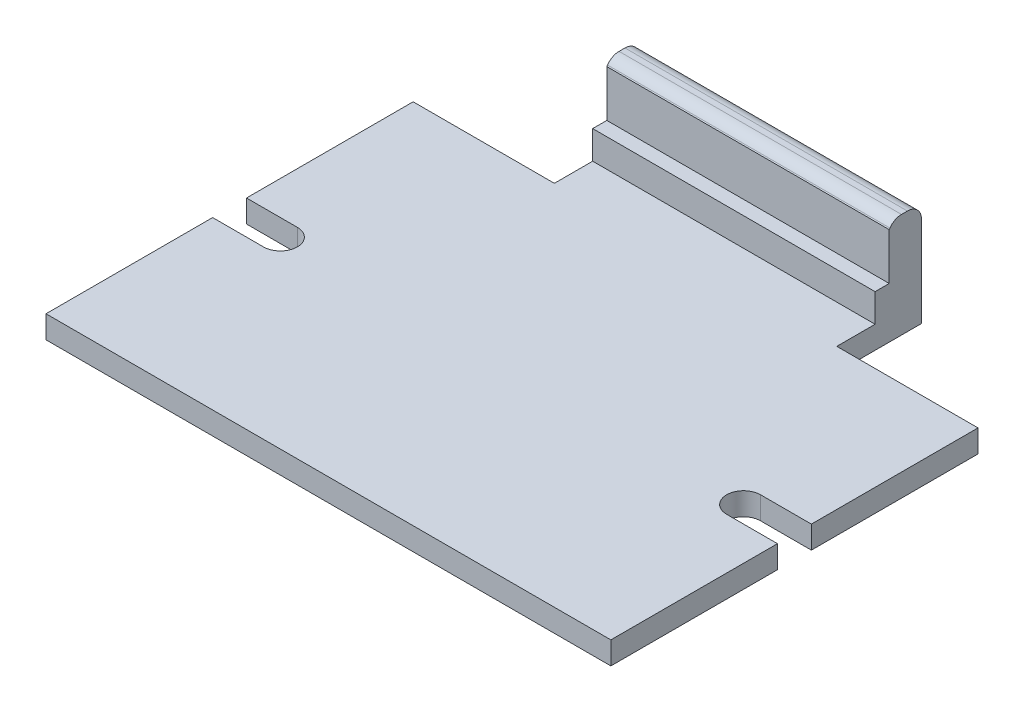
ISO-10303-21;
HEADER;
FILE_DESCRIPTION(('STEP AP214'),'2;1');
FILE_NAME('part.step','',(''),(''),'','','');
FILE_SCHEMA(('AUTOMOTIVE_DESIGN { 1 0 10303 214 1 1 1 1 }'));
ENDSEC;
DATA;
#1=APPLICATION_CONTEXT('core data for automotive mechanical design processes');
#2=APPLICATION_PROTOCOL_DEFINITION('international standard','automotive_design',2000,#1);
#3=PRODUCT_CONTEXT('',#1,'mechanical');
#4=PRODUCT('Part','Part','',(#3));
#5=PRODUCT_RELATED_PRODUCT_CATEGORY('part','',(#4));
#6=PRODUCT_DEFINITION_FORMATION('','',#4);
#7=PRODUCT_DEFINITION_CONTEXT('part definition',#1,'design');
#8=PRODUCT_DEFINITION('design','',#6,#7);
#9=PRODUCT_DEFINITION_SHAPE('','',#8);
#10=(LENGTH_UNIT() NAMED_UNIT(*) SI_UNIT(.MILLI.,.METRE.));
#11=(NAMED_UNIT(*) PLANE_ANGLE_UNIT() SI_UNIT($,.RADIAN.));
#12=(NAMED_UNIT(*) SI_UNIT($,.STERADIAN.) SOLID_ANGLE_UNIT());
#13=UNCERTAINTY_MEASURE_WITH_UNIT(LENGTH_MEASURE(1.E-05),#10,'distance_accuracy_value','');
#14=(GEOMETRIC_REPRESENTATION_CONTEXT(3) GLOBAL_UNCERTAINTY_ASSIGNED_CONTEXT((#13)) GLOBAL_UNIT_ASSIGNED_CONTEXT((#10,
#11,#12)) REPRESENTATION_CONTEXT('',''));
#15=CARTESIAN_POINT('',(0.,0.,0.));
#16=DIRECTION('',(0.,0.,1.));
#17=DIRECTION('',(1.,0.,0.));
#18=AXIS2_PLACEMENT_3D('',#15,#16,#17);
#19=CARTESIAN_POINT('',(200.,32.,-74.0137427767077));
#20=DIRECTION('',(1.,0.,0.));
#21=DIRECTION('',(0.,0.,-1.));
#22=AXIS2_PLACEMENT_3D('',#19,#20,#21);
#23=PLANE('',#22);
#24=DIRECTION('',(0.,-1.,0.));
#25=VECTOR('',#24,1.);
#26=CARTESIAN_POINT('',(200.,9.99999999999999,21.9862572232923));
#27=LINE('',#26,#25);
#28=CARTESIAN_POINT('',(200.,8.00000000000002,21.9862572232923));
#29=VERTEX_POINT('',#28);
#30=CARTESIAN_POINT('',(200.,0.,21.9862572232923));
#31=VERTEX_POINT('',#30);
#32=EDGE_CURVE('E44',#29,#31,#27,.T.);
#33=ORIENTED_EDGE('',*,*,#32,.F.);
#34=DIRECTION('',(0.,0.,1.));
#35=VECTOR('',#34,1.);
#36=CARTESIAN_POINT('',(200.,8.00000000000002,-49.0137427767077));
#37=LINE('',#36,#35);
#38=CARTESIAN_POINT('',(200.,8.,80.9862572232923));
#39=VERTEX_POINT('',#38);
#40=EDGE_CURVE('E283',#29,#39,#37,.T.);
#41=ORIENTED_EDGE('',*,*,#40,.T.);
#42=DIRECTION('',(0.,-1.,0.));
#43=VECTOR('',#42,1.);
#44=CARTESIAN_POINT('',(200.,8.,80.9862572232923));
#45=LINE('',#44,#43);
#46=CARTESIAN_POINT('',(200.,0.,80.9862572232923));
#47=VERTEX_POINT('',#46);
#48=EDGE_CURVE('E281',#39,#47,#45,.T.);
#49=ORIENTED_EDGE('',*,*,#48,.T.);
#50=DIRECTION('',(0.,0.,-1.));
#51=VECTOR('',#50,1.);
#52=CARTESIAN_POINT('',(200.,0.,80.9862572232923));
#53=LINE('',#52,#51);
#54=EDGE_CURVE('E274',#47,#31,#53,.T.);
#55=ORIENTED_EDGE('',*,*,#54,.T.);
#56=EDGE_LOOP('',(#33,#41,#49,#55));
#57=FACE_BOUND('',#56,.T.);
#58=ADVANCED_FACE('F36',(#57),#23,.T.);
#59=CARTESIAN_POINT('',(0.,32.,-74.0137427767077));
#60=DIRECTION('',(1.,0.,0.));
#61=DIRECTION('',(0.,0.,-1.));
#62=AXIS2_PLACEMENT_3D('',#59,#60,#61);
#63=PLANE('',#62);
#64=DIRECTION('',(0.,0.,-1.));
#65=VECTOR('',#64,1.);
#66=CARTESIAN_POINT('',(0.,0.,80.9862572232923));
#67=LINE('',#66,#65);
#68=CARTESIAN_POINT('',(0.,0.,9.98625722329233));
#69=VERTEX_POINT('',#68);
#70=CARTESIAN_POINT('',(0.,0.,-49.0137427767077));
#71=VERTEX_POINT('',#70);
#72=EDGE_CURVE('E293',#69,#71,#67,.T.);
#73=ORIENTED_EDGE('',*,*,#72,.F.);
#74=DIRECTION('',(0.,-1.,0.));
#75=VECTOR('',#74,1.);
#76=CARTESIAN_POINT('',(0.,9.99999999999999,9.98625722329233));
#77=LINE('',#76,#75);
#78=CARTESIAN_POINT('',(0.,8.00000000000002,9.98625722329233));
#79=VERTEX_POINT('',#78);
#80=EDGE_CURVE('E253',#69,#79,#77,.F.);
#81=ORIENTED_EDGE('',*,*,#80,.T.);
#82=DIRECTION('',(0.,0.,1.));
#83=VECTOR('',#82,1.);
#84=CARTESIAN_POINT('',(0.,8.00000000000002,-49.0137427767077));
#85=LINE('',#84,#83);
#86=CARTESIAN_POINT('',(0.,8.00000000000001,-49.0137427767077));
#87=VERTEX_POINT('',#86);
#88=EDGE_CURVE('E298',#87,#79,#85,.T.);
#89=ORIENTED_EDGE('',*,*,#88,.F.);
#90=DIRECTION('',(0.,-1.,0.));
#91=VECTOR('',#90,1.);
#92=CARTESIAN_POINT('',(0.,32.,-49.0137427767077));
#93=LINE('',#92,#91);
#94=EDGE_CURVE('E240',#87,#71,#93,.T.);
#95=ORIENTED_EDGE('',*,*,#94,.T.);
#96=EDGE_LOOP('',(#73,#81,#89,#95));
#97=FACE_BOUND('',#96,.T.);
#98=ADVANCED_FACE('F419',(#97),#63,.F.);
#99=CARTESIAN_POINT('',(200.,8.,80.9862572232923));
#100=DIRECTION('',(0.,0.,-1.));
#101=DIRECTION('',(-1.,0.,0.));
#102=AXIS2_PLACEMENT_3D('',#99,#100,#101);
#103=PLANE('',#102);
#104=DIRECTION('',(0.,-1.,0.));
#105=VECTOR('',#104,1.);
#106=CARTESIAN_POINT('',(0.,8.,80.9862572232923));
#107=LINE('',#106,#105);
#108=CARTESIAN_POINT('',(0.,8.,80.9862572232923));
#109=VERTEX_POINT('',#108);
#110=CARTESIAN_POINT('',(0.,0.,80.9862572232923));
#111=VERTEX_POINT('',#110);
#112=EDGE_CURVE('E290',#109,#111,#107,.T.);
#113=ORIENTED_EDGE('',*,*,#112,.T.);
#114=DIRECTION('',(-1.,0.,0.));
#115=VECTOR('',#114,1.);
#116=CARTESIAN_POINT('',(200.,0.,80.9862572232923));
#117=LINE('',#116,#115);
#118=EDGE_CURVE('E237',#47,#111,#117,.T.);
#119=ORIENTED_EDGE('',*,*,#118,.F.);
#120=ORIENTED_EDGE('',*,*,#48,.F.);
#121=DIRECTION('',(-1.,0.,0.));
#122=VECTOR('',#121,1.);
#123=CARTESIAN_POINT('',(200.,8.,80.9862572232923));
#124=LINE('',#123,#122);
#125=EDGE_CURVE('E222',#39,#109,#124,.T.);
#126=ORIENTED_EDGE('',*,*,#125,.T.);
#127=EDGE_LOOP('',(#113,#119,#120,#126));
#128=FACE_BOUND('',#127,.T.);
#129=ADVANCED_FACE('F38',(#128),#103,.F.);
#130=CARTESIAN_POINT('',(200.,0.,80.9862572232923));
#131=DIRECTION('',(0.,1.,0.));
#132=DIRECTION('',(0.,0.,1.));
#133=AXIS2_PLACEMENT_3D('',#130,#131,#132);
#134=PLANE('',#133);
#135=CARTESIAN_POINT('',(182.,0.,15.9862572232923));
#136=DIRECTION('',(0.,-1.,0.));
#137=DIRECTION('',(0.,0.,1.));
#138=AXIS2_PLACEMENT_3D('',#135,#136,#137);
#139=CIRCLE('',#138,6.);
#140=CARTESIAN_POINT('',(182.,0.,21.9862572232923));
#141=VERTEX_POINT('',#140);
#142=CARTESIAN_POINT('',(182.,0.,9.98625722329233));
#143=VERTEX_POINT('',#142);
#144=EDGE_CURVE('E277',#141,#143,#139,.T.);
#145=ORIENTED_EDGE('',*,*,#144,.F.);
#146=DIRECTION('',(-1.,0.,0.));
#147=VECTOR('',#146,1.);
#148=CARTESIAN_POINT('',(182.,0.,21.9862572232923));
#149=LINE('',#148,#147);
#150=EDGE_CURVE('E266',#31,#141,#149,.T.);
#151=ORIENTED_EDGE('',*,*,#150,.F.);
#152=ORIENTED_EDGE('',*,*,#54,.F.);
#153=ORIENTED_EDGE('',*,*,#118,.T.);
#154=CARTESIAN_POINT('',(0.,0.,21.9862572232923));
#155=VERTEX_POINT('',#154);
#156=EDGE_CURVE('E295',#111,#155,#67,.T.);
#157=ORIENTED_EDGE('',*,*,#156,.T.);
#158=DIRECTION('',(-1.,0.,0.));
#159=VECTOR('',#158,1.);
#160=CARTESIAN_POINT('',(18.,0.,21.9862572232923));
#161=LINE('',#160,#159);
#162=CARTESIAN_POINT('',(18.,0.,21.9862572232923));
#163=VERTEX_POINT('',#162);
#164=EDGE_CURVE('E312',#163,#155,#161,.T.);
#165=ORIENTED_EDGE('',*,*,#164,.F.);
#166=CARTESIAN_POINT('',(18.,0.,15.9862572232923));
#167=DIRECTION('',(0.,-1.,0.));
#168=DIRECTION('',(0.,0.,-1.));
#169=AXIS2_PLACEMENT_3D('',#166,#167,#168);
#170=CIRCLE('',#169,6.);
#171=CARTESIAN_POINT('',(18.,0.,9.98625722329233));
#172=VERTEX_POINT('',#171);
#173=EDGE_CURVE('E315',#172,#163,#170,.T.);
#174=ORIENTED_EDGE('',*,*,#173,.F.);
#175=DIRECTION('',(1.,0.,0.));
#176=VECTOR('',#175,1.);
#177=CARTESIAN_POINT('',(18.,0.,9.98625722329233));
#178=LINE('',#177,#176);
#179=EDGE_CURVE('E317',#69,#172,#178,.T.);
#180=ORIENTED_EDGE('',*,*,#179,.F.);
#181=ORIENTED_EDGE('',*,*,#72,.T.);
#182=DIRECTION('',(-1.,0.,0.));
#183=VECTOR('',#182,1.);
#184=CARTESIAN_POINT('',(50.,0.,-49.0137427767077));
#185=LINE('',#184,#183);
#186=CARTESIAN_POINT('',(50.,0.,-49.0137427767077));
#187=VERTEX_POINT('',#186);
#188=EDGE_CURVE('E347',#187,#71,#185,.T.);
#189=ORIENTED_EDGE('',*,*,#188,.F.);
#190=DIRECTION('',(0.,0.,1.));
#191=VECTOR('',#190,1.);
#192=CARTESIAN_POINT('',(50.,0.,-49.0137427767077));
#193=LINE('',#192,#191);
#194=CARTESIAN_POINT('',(50.,0.,-79.0137427767077));
#195=VERTEX_POINT('',#194);
#196=EDGE_CURVE('E344',#195,#187,#193,.T.);
#197=ORIENTED_EDGE('',*,*,#196,.F.);
#198=DIRECTION('',(-1.,0.,0.));
#199=VECTOR('',#198,1.);
#200=CARTESIAN_POINT('',(200.,0.,-79.0137427767077));
#201=LINE('',#200,#199);
#202=CARTESIAN_POINT('',(150.,0.,-79.0137427767077));
#203=VERTEX_POINT('',#202);
#204=EDGE_CURVE('E235',#203,#195,#201,.T.);
#205=ORIENTED_EDGE('',*,*,#204,.F.);
#206=DIRECTION('',(0.,0.,-1.));
#207=VECTOR('',#206,1.);
#208=CARTESIAN_POINT('',(150.,0.,-49.0137427767077));
#209=LINE('',#208,#207);
#210=CARTESIAN_POINT('',(150.,0.,-49.0137427767077));
#211=VERTEX_POINT('',#210);
#212=EDGE_CURVE('E213',#211,#203,#209,.T.);
#213=ORIENTED_EDGE('',*,*,#212,.F.);
#214=DIRECTION('',(-1.,0.,0.));
#215=VECTOR('',#214,1.);
#216=CARTESIAN_POINT('',(150.,0.,-49.0137427767077));
#217=LINE('',#216,#215);
#218=CARTESIAN_POINT('',(200.,0.,-49.0137427767077));
#219=VERTEX_POINT('',#218);
#220=EDGE_CURVE('E210',#219,#211,#217,.T.);
#221=ORIENTED_EDGE('',*,*,#220,.F.);
#222=CARTESIAN_POINT('',(200.,0.,9.98625722329233));
#223=VERTEX_POINT('',#222);
#224=EDGE_CURVE('E284',#223,#219,#53,.T.);
#225=ORIENTED_EDGE('',*,*,#224,.F.);
#226=DIRECTION('',(1.,0.,0.));
#227=VECTOR('',#226,1.);
#228=CARTESIAN_POINT('',(182.,0.,9.98625722329233));
#229=LINE('',#228,#227);
#230=EDGE_CURVE('E59',#143,#223,#229,.T.);
#231=ORIENTED_EDGE('',*,*,#230,.F.);
#232=EDGE_LOOP('',(#145,#151,#152,#153,#157,#165,#174,#180,#181,#189,#197,#205,#213,#221,#225,#231));
#233=FACE_BOUND('',#232,.T.);
#234=ADVANCED_FACE('F273',(#233),#134,.F.);
#235=CARTESIAN_POINT('',(200.,0.,-79.0137427767077));
#236=DIRECTION('',(0.,0.,1.));
#237=DIRECTION('',(1.,0.,0.));
#238=AXIS2_PLACEMENT_3D('',#235,#236,#237);
#239=PLANE('',#238);
#240=DIRECTION('',(-1.,0.,0.));
#241=VECTOR('',#240,1.);
#242=CARTESIAN_POINT('',(200.,32.,-79.0137427767077));
#243=LINE('',#242,#241);
#244=CARTESIAN_POINT('',(150.,32.,-79.0137427767077));
#245=VERTEX_POINT('',#244);
#246=CARTESIAN_POINT('',(50.,32.,-79.0137427767077));
#247=VERTEX_POINT('',#246);
#248=EDGE_CURVE('E233',#245,#247,#243,.T.);
#249=ORIENTED_EDGE('',*,*,#248,.F.);
#250=DIRECTION('',(0.,-1.,0.));
#251=VECTOR('',#250,1.);
#252=CARTESIAN_POINT('',(150.,52.,-79.0137427767077));
#253=LINE('',#252,#251);
#254=EDGE_CURVE('E212',#245,#203,#253,.T.);
#255=ORIENTED_EDGE('',*,*,#254,.T.);
#256=ORIENTED_EDGE('',*,*,#204,.T.);
#257=DIRECTION('',(0.,-1.,0.));
#258=VECTOR('',#257,1.);
#259=CARTESIAN_POINT('',(50.,52.,-79.0137427767077));
#260=LINE('',#259,#258);
#261=EDGE_CURVE('E351',#247,#195,#260,.T.);
#262=ORIENTED_EDGE('',*,*,#261,.F.);
#263=EDGE_LOOP('',(#249,#255,#256,#262));
#264=FACE_BOUND('',#263,.T.);
#265=ADVANCED_FACE('F376',(#264),#239,.F.);
#266=CARTESIAN_POINT('',(200.,32.,-74.0137427767077));
#267=DIRECTION('',(-1.,0.,0.));
#268=DIRECTION('',(0.,0.,1.));
#269=AXIS2_PLACEMENT_3D('',#266,#267,#268);
#270=CYLINDRICAL_SURFACE('',#269,5.);
#271=DIRECTION('',(-1.,0.,0.));
#272=VECTOR('',#271,1.);
#273=CARTESIAN_POINT('',(200.,37.,-74.0137427767077));
#274=LINE('',#273,#272);
#275=CARTESIAN_POINT('',(150.,37.,-74.0137427767077));
#276=VERTEX_POINT('',#275);
#277=CARTESIAN_POINT('',(50.,37.,-74.0137427767077));
#278=VERTEX_POINT('',#277);
#279=EDGE_CURVE('E231',#276,#278,#274,.T.);
#280=ORIENTED_EDGE('',*,*,#279,.F.);
#281=CARTESIAN_POINT('',(150.,32.,-74.0137427767077));
#282=DIRECTION('',(-1.,0.,0.));
#283=DIRECTION('',(0.,0.,1.));
#284=AXIS2_PLACEMENT_3D('',#281,#282,#283);
#285=CIRCLE('',#284,5.);
#286=EDGE_CURVE('E341',#276,#245,#285,.T.);
#287=ORIENTED_EDGE('',*,*,#286,.T.);
#288=ORIENTED_EDGE('',*,*,#248,.T.);
#289=CARTESIAN_POINT('',(50.,32.,-74.0137427767077));
#290=DIRECTION('',(1.,0.,0.));
#291=DIRECTION('',(0.,0.,-1.));
#292=AXIS2_PLACEMENT_3D('',#289,#290,#291);
#293=CIRCLE('',#292,5.);
#294=EDGE_CURVE('E294',#247,#278,#293,.T.);
#295=ORIENTED_EDGE('',*,*,#294,.T.);
#296=EDGE_LOOP('',(#280,#287,#288,#295));
#297=FACE_BOUND('',#296,.T.);
#298=ADVANCED_FACE('F366',(#297),#270,.T.);
#299=CARTESIAN_POINT('',(200.,37.,-74.0137427767077));
#300=DIRECTION('',(0.,-1.,0.));
#301=DIRECTION('',(0.,0.,-1.));
#302=AXIS2_PLACEMENT_3D('',#299,#300,#301);
#303=PLANE('',#302);
#304=DIRECTION('',(-1.,0.,0.));
#305=VECTOR('',#304,1.);
#306=CARTESIAN_POINT('',(200.,37.,-71.9225966375477));
#307=LINE('',#306,#305);
#308=CARTESIAN_POINT('',(150.,37.,-71.9225966375477));
#309=VERTEX_POINT('',#308);
#310=CARTESIAN_POINT('',(50.,37.,-71.9225966375477));
#311=VERTEX_POINT('',#310);
#312=EDGE_CURVE('E224',#309,#311,#307,.T.);
#313=ORIENTED_EDGE('',*,*,#312,.F.);
#314=DIRECTION('',(0.,0.,-1.));
#315=VECTOR('',#314,1.);
#316=CARTESIAN_POINT('',(150.,37.,-74.0137427767077));
#317=LINE('',#316,#315);
#318=EDGE_CURVE('E338',#309,#276,#317,.T.);
#319=ORIENTED_EDGE('',*,*,#318,.T.);
#320=ORIENTED_EDGE('',*,*,#279,.T.);
#321=DIRECTION('',(0.,0.,1.));
#322=VECTOR('',#321,1.);
#323=CARTESIAN_POINT('',(50.,37.,-74.0137427767077));
#324=LINE('',#323,#322);
#325=EDGE_CURVE('E360',#278,#311,#324,.T.);
#326=ORIENTED_EDGE('',*,*,#325,.T.);
#327=EDGE_LOOP('',(#313,#319,#320,#326));
#328=FACE_BOUND('',#327,.T.);
#329=ADVANCED_FACE('F439',(#328),#303,.F.);
#330=CARTESIAN_POINT('',(200.,32.,-71.9225966375477));
#331=DIRECTION('',(-1.,0.,0.));
#332=DIRECTION('',(0.,0.,1.));
#333=AXIS2_PLACEMENT_3D('',#330,#331,#332);
#334=CYLINDRICAL_SURFACE('',#333,5.);
#335=DIRECTION('',(-1.,0.,0.));
#336=VECTOR('',#335,1.);
#337=CARTESIAN_POINT('',(200.,34.8678821817552,-67.8268364161028));
#338=LINE('',#337,#336);
#339=CARTESIAN_POINT('',(150.,34.8678821817552,-67.8268364161028));
#340=VERTEX_POINT('',#339);
#341=CARTESIAN_POINT('',(50.,34.8678821817552,-67.8268364161028));
#342=VERTEX_POINT('',#341);
#343=EDGE_CURVE('E221',#340,#342,#338,.T.);
#344=ORIENTED_EDGE('',*,*,#343,.F.);
#345=CARTESIAN_POINT('',(150.,32.,-71.9225966375477));
#346=DIRECTION('',(-1.,0.,0.));
#347=DIRECTION('',(0.,0.,1.));
#348=AXIS2_PLACEMENT_3D('',#345,#346,#347);
#349=CIRCLE('',#348,5.);
#350=EDGE_CURVE('E334',#340,#309,#349,.T.);
#351=ORIENTED_EDGE('',*,*,#350,.T.);
#352=ORIENTED_EDGE('',*,*,#312,.T.);
#353=CARTESIAN_POINT('',(50.,32.,-71.9225966375477));
#354=DIRECTION('',(1.,0.,0.));
#355=DIRECTION('',(0.,0.,-1.));
#356=AXIS2_PLACEMENT_3D('',#353,#354,#355);
#357=CIRCLE('',#356,5.);
#358=EDGE_CURVE('E357',#311,#342,#357,.T.);
#359=ORIENTED_EDGE('',*,*,#358,.T.);
#360=EDGE_LOOP('',(#344,#351,#352,#359));
#361=FACE_BOUND('',#360,.T.);
#362=ADVANCED_FACE('F435',(#361),#334,.T.);
#363=CARTESIAN_POINT('',(200.,34.8678821817552,-67.8268364161028));
#364=DIRECTION('',(0.,-0.573576436351041,-0.819152044288995));
#365=DIRECTION('',(0.,0.819152044288995,-0.573576436351041));
#366=AXIS2_PLACEMENT_3D('',#363,#364,#365);
#367=PLANE('',#366);
#368=DIRECTION('',(0.,-0.819152044288995,0.573576436351041));
#369=VECTOR('',#368,1.);
#370=CARTESIAN_POINT('',(50.,34.8678821817553,-67.8268364161028));
#371=LINE('',#370,#369);
#372=CARTESIAN_POINT('',(50.,34.5115757965798,-67.5773479992907));
#373=VERTEX_POINT('',#372);
#374=EDGE_CURVE('E243',#342,#373,#371,.T.);
#375=ORIENTED_EDGE('',*,*,#374,.T.);
#376=DIRECTION('',(1.,0.,0.));
#377=VECTOR('',#376,1.);
#378=CARTESIAN_POINT('',(200.,34.5115757965798,-67.5773479992907));
#379=LINE('',#378,#377);
#380=CARTESIAN_POINT('',(150.,34.5115757965798,-67.5773479992907));
#381=VERTEX_POINT('',#380);
#382=EDGE_CURVE('E388',#373,#381,#379,.T.);
#383=ORIENTED_EDGE('',*,*,#382,.T.);
#384=DIRECTION('',(0.,0.819152044288995,-0.573576436351041));
#385=VECTOR('',#384,1.);
#386=CARTESIAN_POINT('',(150.,34.8678821817552,-67.8268364161028));
#387=LINE('',#386,#385);
#388=EDGE_CURVE('E248',#381,#340,#387,.T.);
#389=ORIENTED_EDGE('',*,*,#388,.T.);
#390=ORIENTED_EDGE('',*,*,#343,.T.);
#391=EDGE_LOOP('',(#375,#383,#389,#390));
#392=FACE_BOUND('',#391,.T.);
#393=ADVANCED_FACE('F420',(#392),#367,.F.);
#394=CARTESIAN_POINT('',(200.,8.00000000000002,-49.0137427767077));
#395=DIRECTION('',(0.,-1.,0.));
#396=DIRECTION('',(0.,0.,-1.));
#397=AXIS2_PLACEMENT_3D('',#394,#395,#396);
#398=PLANE('',#397);
#399=ORIENTED_EDGE('',*,*,#40,.F.);
#400=DIRECTION('',(-1.,0.,0.));
#401=VECTOR('',#400,1.);
#402=CARTESIAN_POINT('',(200.,8.00000000000001,21.9862572232923));
#403=LINE('',#402,#401);
#404=CARTESIAN_POINT('',(182.,8.00000000000001,21.9862572232923));
#405=VERTEX_POINT('',#404);
#406=EDGE_CURVE('E269',#29,#405,#403,.T.);
#407=ORIENTED_EDGE('',*,*,#406,.T.);
#408=CARTESIAN_POINT('',(182.,8.00000000000001,15.9862572232923));
#409=DIRECTION('',(0.,-1.,0.));
#410=DIRECTION('',(0.,0.,-1.));
#411=AXIS2_PLACEMENT_3D('',#408,#409,#410);
#412=CIRCLE('',#411,6.);
#413=CARTESIAN_POINT('',(182.,8.00000000000001,9.98625722329233));
#414=VERTEX_POINT('',#413);
#415=EDGE_CURVE('E11',#405,#414,#412,.T.);
#416=ORIENTED_EDGE('',*,*,#415,.T.);
#417=DIRECTION('',(1.,0.,0.));
#418=VECTOR('',#417,1.);
#419=CARTESIAN_POINT('',(200.,8.00000000000001,9.98625722329233));
#420=LINE('',#419,#418);
#421=CARTESIAN_POINT('',(200.,8.00000000000001,9.98625722329233));
#422=VERTEX_POINT('',#421);
#423=EDGE_CURVE('E403',#414,#422,#420,.T.);
#424=ORIENTED_EDGE('',*,*,#423,.T.);
#425=CARTESIAN_POINT('',(200.,8.00000000000002,-49.0137427767077));
#426=VERTEX_POINT('',#425);
#427=EDGE_CURVE('E220',#426,#422,#37,.T.);
#428=ORIENTED_EDGE('',*,*,#427,.F.);
#429=DIRECTION('',(-1.,0.,0.));
#430=VECTOR('',#429,1.);
#431=CARTESIAN_POINT('',(200.,8.00000000000002,-49.0137427767077));
#432=LINE('',#431,#430);
#433=CARTESIAN_POINT('',(150.,8.00000000000002,-49.0137427767077));
#434=VERTEX_POINT('',#433);
#435=EDGE_CURVE('E207',#426,#434,#432,.T.);
#436=ORIENTED_EDGE('',*,*,#435,.T.);
#437=DIRECTION('',(0.,0.,-1.));
#438=VECTOR('',#437,1.);
#439=CARTESIAN_POINT('',(150.,8.00000000000002,-62.5773479992906));
#440=LINE('',#439,#438);
#441=CARTESIAN_POINT('',(150.,8.00000000000002,-62.5773479992906));
#442=VERTEX_POINT('',#441);
#443=EDGE_CURVE('E192',#434,#442,#440,.T.);
#444=ORIENTED_EDGE('',*,*,#443,.T.);
#445=DIRECTION('',(1.,0.,0.));
#446=VECTOR('',#445,1.);
#447=CARTESIAN_POINT('',(44.801322915654,8.00000000000002,-62.5773479992906));
#448=LINE('',#447,#446);
#449=CARTESIAN_POINT('',(50.,8.00000000000002,-62.5773479992906));
#450=VERTEX_POINT('',#449);
#451=EDGE_CURVE('E386',#450,#442,#448,.T.);
#452=ORIENTED_EDGE('',*,*,#451,.F.);
#453=DIRECTION('',(0.,0.,-1.));
#454=VECTOR('',#453,1.);
#455=CARTESIAN_POINT('',(50.,8.00000000000001,-49.0137427767077));
#456=LINE('',#455,#454);
#457=CARTESIAN_POINT('',(50.,8.00000000000002,-49.0137427767077));
#458=VERTEX_POINT('',#457);
#459=EDGE_CURVE('E381',#458,#450,#456,.T.);
#460=ORIENTED_EDGE('',*,*,#459,.F.);
#461=DIRECTION('',(-1.,0.,0.));
#462=VECTOR('',#461,1.);
#463=CARTESIAN_POINT('',(200.,8.00000000000002,-49.0137427767077));
#464=LINE('',#463,#462);
#465=EDGE_CURVE('E354',#458,#87,#464,.T.);
#466=ORIENTED_EDGE('',*,*,#465,.T.);
#467=ORIENTED_EDGE('',*,*,#88,.T.);
#468=DIRECTION('',(1.,0.,0.));
#469=VECTOR('',#468,1.);
#470=CARTESIAN_POINT('',(200.,8.00000000000001,9.98625722329239));
#471=LINE('',#470,#469);
#472=CARTESIAN_POINT('',(18.,8.00000000000001,9.98625722329233));
#473=VERTEX_POINT('',#472);
#474=EDGE_CURVE('E329',#79,#473,#471,.T.);
#475=ORIENTED_EDGE('',*,*,#474,.T.);
#476=CARTESIAN_POINT('',(18.,8.00000000000001,15.9862572232923));
#477=DIRECTION('',(0.,-1.,0.));
#478=DIRECTION('',(0.,0.,-1.));
#479=AXIS2_PLACEMENT_3D('',#476,#477,#478);
#480=CIRCLE('',#479,6.);
#481=CARTESIAN_POINT('',(18.,8.00000000000001,21.9862572232923));
#482=VERTEX_POINT('',#481);
#483=EDGE_CURVE('E256',#473,#482,#480,.T.);
#484=ORIENTED_EDGE('',*,*,#483,.T.);
#485=DIRECTION('',(-1.,0.,0.));
#486=VECTOR('',#485,1.);
#487=CARTESIAN_POINT('',(200.,8.00000000000001,21.9862572232923));
#488=LINE('',#487,#486);
#489=CARTESIAN_POINT('',(0.,8.00000000000001,21.9862572232923));
#490=VERTEX_POINT('',#489);
#491=EDGE_CURVE('E305',#482,#490,#488,.T.);
#492=ORIENTED_EDGE('',*,*,#491,.T.);
#493=EDGE_CURVE('E297',#490,#109,#85,.T.);
#494=ORIENTED_EDGE('',*,*,#493,.T.);
#495=ORIENTED_EDGE('',*,*,#125,.F.);
#496=EDGE_LOOP('',(#399,#407,#416,#424,#428,#436,#444,#452,#460,#466,#467,#475,#484,#492,#494,#495));
#497=FACE_BOUND('',#496,.T.);
#498=ADVANCED_FACE('F217',(#497),#398,.F.);
#499=DIRECTION('',(0.,1.,0.));
#500=VECTOR('',#499,1.);
#501=CARTESIAN_POINT('',(200.,32.,9.98625722329233));
#502=LINE('',#501,#500);
#503=EDGE_CURVE('E259',#223,#422,#502,.T.);
#504=ORIENTED_EDGE('',*,*,#503,.F.);
#505=ORIENTED_EDGE('',*,*,#224,.T.);
#506=DIRECTION('',(0.,-1.,0.));
#507=VECTOR('',#506,1.);
#508=CARTESIAN_POINT('',(200.,32.,-49.0137427767077));
#509=LINE('',#508,#507);
#510=EDGE_CURVE('E246',#426,#219,#509,.T.);
#511=ORIENTED_EDGE('',*,*,#510,.F.);
#512=ORIENTED_EDGE('',*,*,#427,.T.);
#513=EDGE_LOOP('',(#504,#505,#511,#512));
#514=FACE_BOUND('',#513,.T.);
#515=ADVANCED_FACE('F411',(#514),#23,.T.);
#516=ORIENTED_EDGE('',*,*,#493,.F.);
#517=DIRECTION('',(0.,-1.,0.));
#518=VECTOR('',#517,1.);
#519=CARTESIAN_POINT('',(0.,32.,21.9862572232923));
#520=LINE('',#519,#518);
#521=EDGE_CURVE('E250',#490,#155,#520,.T.);
#522=ORIENTED_EDGE('',*,*,#521,.T.);
#523=ORIENTED_EDGE('',*,*,#156,.F.);
#524=ORIENTED_EDGE('',*,*,#112,.F.);
#525=EDGE_LOOP('',(#516,#522,#523,#524));
#526=FACE_BOUND('',#525,.T.);
#527=ADVANCED_FACE('F309',(#526),#63,.F.);
#528=CARTESIAN_POINT('',(50.,52.,-49.0137427767077));
#529=DIRECTION('',(1.,0.,0.));
#530=DIRECTION('',(0.,0.,-1.));
#531=AXIS2_PLACEMENT_3D('',#528,#529,#530);
#532=PLANE('',#531);
#533=DIRECTION('',(0.,-1.,0.));
#534=VECTOR('',#533,1.);
#535=CARTESIAN_POINT('',(50.,52.,-49.0137427767077));
#536=LINE('',#535,#534);
#537=EDGE_CURVE('E350',#458,#187,#536,.T.);
#538=ORIENTED_EDGE('',*,*,#537,.F.);
#539=ORIENTED_EDGE('',*,*,#459,.T.);
#540=DIRECTION('',(0.,1.,0.));
#541=VECTOR('',#540,1.);
#542=CARTESIAN_POINT('',(50.,52.,-62.5773479992906));
#543=LINE('',#542,#541);
#544=CARTESIAN_POINT('',(50.,18.,-62.5773479992906));
#545=VERTEX_POINT('',#544);
#546=EDGE_CURVE('E387',#450,#545,#543,.T.);
#547=ORIENTED_EDGE('',*,*,#546,.T.);
#548=DIRECTION('',(0.,0.,-1.));
#549=VECTOR('',#548,1.);
#550=CARTESIAN_POINT('',(50.,18.,-49.0137427767077));
#551=LINE('',#550,#549);
#552=CARTESIAN_POINT('',(50.,18.,-67.5773479992907));
#553=VERTEX_POINT('',#552);
#554=EDGE_CURVE('E390',#545,#553,#551,.T.);
#555=ORIENTED_EDGE('',*,*,#554,.T.);
#556=DIRECTION('',(0.,1.,0.));
#557=VECTOR('',#556,1.);
#558=CARTESIAN_POINT('',(50.,52.,-67.5773479992907));
#559=LINE('',#558,#557);
#560=EDGE_CURVE('E393',#553,#373,#559,.T.);
#561=ORIENTED_EDGE('',*,*,#560,.T.);
#562=ORIENTED_EDGE('',*,*,#374,.F.);
#563=ORIENTED_EDGE('',*,*,#358,.F.);
#564=ORIENTED_EDGE('',*,*,#325,.F.);
#565=ORIENTED_EDGE('',*,*,#294,.F.);
#566=ORIENTED_EDGE('',*,*,#261,.T.);
#567=ORIENTED_EDGE('',*,*,#196,.T.);
#568=EDGE_LOOP('',(#538,#539,#547,#555,#561,#562,#563,#564,#565,#566,#567));
#569=FACE_BOUND('',#568,.T.);
#570=ADVANCED_FACE('F372',(#569),#532,.F.);
#571=CARTESIAN_POINT('',(50.,52.,-49.0137427767077));
#572=DIRECTION('',(0.,0.,1.));
#573=DIRECTION('',(1.,0.,0.));
#574=AXIS2_PLACEMENT_3D('',#571,#572,#573);
#575=PLANE('',#574);
#576=ORIENTED_EDGE('',*,*,#537,.T.);
#577=ORIENTED_EDGE('',*,*,#188,.T.);
#578=ORIENTED_EDGE('',*,*,#94,.F.);
#579=ORIENTED_EDGE('',*,*,#465,.F.);
#580=EDGE_LOOP('',(#576,#577,#578,#579));
#581=FACE_BOUND('',#580,.T.);
#582=ADVANCED_FACE('F384',(#581),#575,.F.);
#583=CARTESIAN_POINT('',(150.,52.,-49.0137427767077));
#584=DIRECTION('',(-1.,0.,0.));
#585=DIRECTION('',(0.,0.,1.));
#586=AXIS2_PLACEMENT_3D('',#583,#584,#585);
#587=PLANE('',#586);
#588=DIRECTION('',(0.,1.,0.));
#589=VECTOR('',#588,1.);
#590=CARTESIAN_POINT('',(150.,18.,-62.5773479992906));
#591=LINE('',#590,#589);
#592=CARTESIAN_POINT('',(150.,18.,-62.5773479992906));
#593=VERTEX_POINT('',#592);
#594=EDGE_CURVE('E198',#442,#593,#591,.T.);
#595=ORIENTED_EDGE('',*,*,#594,.F.);
#596=ORIENTED_EDGE('',*,*,#443,.F.);
#597=DIRECTION('',(0.,-1.,0.));
#598=VECTOR('',#597,1.);
#599=CARTESIAN_POINT('',(150.,52.,-49.0137427767077));
#600=LINE('',#599,#598);
#601=EDGE_CURVE('E195',#434,#211,#600,.T.);
#602=ORIENTED_EDGE('',*,*,#601,.T.);
#603=ORIENTED_EDGE('',*,*,#212,.T.);
#604=ORIENTED_EDGE('',*,*,#254,.F.);
#605=ORIENTED_EDGE('',*,*,#286,.F.);
#606=ORIENTED_EDGE('',*,*,#318,.F.);
#607=ORIENTED_EDGE('',*,*,#350,.F.);
#608=ORIENTED_EDGE('',*,*,#388,.F.);
#609=DIRECTION('',(0.,1.,0.));
#610=VECTOR('',#609,1.);
#611=CARTESIAN_POINT('',(150.,37.,-67.5773479992907));
#612=LINE('',#611,#610);
#613=CARTESIAN_POINT('',(150.,18.,-67.5773479992907));
#614=VERTEX_POINT('',#613);
#615=EDGE_CURVE('E202',#614,#381,#612,.T.);
#616=ORIENTED_EDGE('',*,*,#615,.F.);
#617=DIRECTION('',(0.,0.,-1.));
#618=VECTOR('',#617,1.);
#619=CARTESIAN_POINT('',(150.,18.,-67.5773479992907));
#620=LINE('',#619,#618);
#621=EDGE_CURVE('E51',#593,#614,#620,.T.);
#622=ORIENTED_EDGE('',*,*,#621,.F.);
#623=EDGE_LOOP('',(#595,#596,#602,#603,#604,#605,#606,#607,#608,#616,#622));
#624=FACE_BOUND('',#623,.T.);
#625=ADVANCED_FACE('F194',(#624),#587,.F.);
#626=CARTESIAN_POINT('',(150.,52.,-49.0137427767077));
#627=DIRECTION('',(0.,0.,1.));
#628=DIRECTION('',(1.,0.,0.));
#629=AXIS2_PLACEMENT_3D('',#626,#627,#628);
#630=PLANE('',#629);
#631=ORIENTED_EDGE('',*,*,#510,.T.);
#632=ORIENTED_EDGE('',*,*,#220,.T.);
#633=ORIENTED_EDGE('',*,*,#601,.F.);
#634=ORIENTED_EDGE('',*,*,#435,.F.);
#635=EDGE_LOOP('',(#631,#632,#633,#634));
#636=FACE_BOUND('',#635,.T.);
#637=ADVANCED_FACE('F206',(#636),#630,.F.);
#638=CARTESIAN_POINT('',(18.,9.99999999999999,15.9862572232923));
#639=DIRECTION('',(0.,-1.,0.));
#640=DIRECTION('',(0.,0.,-1.));
#641=AXIS2_PLACEMENT_3D('',#638,#639,#640);
#642=CYLINDRICAL_SURFACE('',#641,6.);
#643=DIRECTION('',(0.,-1.,0.));
#644=VECTOR('',#643,1.);
#645=CARTESIAN_POINT('',(18.,9.99999999999999,9.98625722329233));
#646=LINE('',#645,#644);
#647=EDGE_CURVE('E325',#473,#172,#646,.T.);
#648=ORIENTED_EDGE('',*,*,#647,.T.);
#649=ORIENTED_EDGE('',*,*,#173,.T.);
#650=DIRECTION('',(0.,-1.,0.));
#651=VECTOR('',#650,1.);
#652=CARTESIAN_POINT('',(18.,9.99999999999999,21.9862572232923));
#653=LINE('',#652,#651);
#654=EDGE_CURVE('E320',#482,#163,#653,.T.);
#655=ORIENTED_EDGE('',*,*,#654,.F.);
#656=ORIENTED_EDGE('',*,*,#483,.F.);
#657=EDGE_LOOP('',(#648,#649,#655,#656));
#658=FACE_BOUND('',#657,.T.);
#659=ADVANCED_FACE('F513',(#658),#642,.F.);
#660=CARTESIAN_POINT('',(18.,9.99999999999999,9.98625722329233));
#661=DIRECTION('',(0.,0.,-1.));
#662=DIRECTION('',(-1.,0.,0.));
#663=AXIS2_PLACEMENT_3D('',#660,#661,#662);
#664=PLANE('',#663);
#665=ORIENTED_EDGE('',*,*,#80,.F.);
#666=ORIENTED_EDGE('',*,*,#179,.T.);
#667=ORIENTED_EDGE('',*,*,#647,.F.);
#668=ORIENTED_EDGE('',*,*,#474,.F.);
#669=EDGE_LOOP('',(#665,#666,#667,#668));
#670=FACE_BOUND('',#669,.T.);
#671=ADVANCED_FACE('F555',(#670),#664,.F.);
#672=CARTESIAN_POINT('',(18.,9.99999999999999,21.9862572232923));
#673=DIRECTION('',(0.,0.,1.));
#674=DIRECTION('',(1.,0.,0.));
#675=AXIS2_PLACEMENT_3D('',#672,#673,#674);
#676=PLANE('',#675);
#677=ORIENTED_EDGE('',*,*,#654,.T.);
#678=ORIENTED_EDGE('',*,*,#164,.T.);
#679=ORIENTED_EDGE('',*,*,#521,.F.);
#680=ORIENTED_EDGE('',*,*,#491,.F.);
#681=EDGE_LOOP('',(#677,#678,#679,#680));
#682=FACE_BOUND('',#681,.T.);
#683=ADVANCED_FACE('F554',(#682),#676,.F.);
#684=CARTESIAN_POINT('',(182.,9.99999999999999,15.9862572232923));
#685=DIRECTION('',(0.,-1.,0.));
#686=DIRECTION('',(0.,0.,-1.));
#687=AXIS2_PLACEMENT_3D('',#684,#685,#686);
#688=CYLINDRICAL_SURFACE('',#687,6.);
#689=DIRECTION('',(0.,-1.,0.));
#690=VECTOR('',#689,1.);
#691=CARTESIAN_POINT('',(182.,9.99999999999999,21.9862572232923));
#692=LINE('',#691,#690);
#693=EDGE_CURVE('E401',#405,#141,#692,.T.);
#694=ORIENTED_EDGE('',*,*,#693,.T.);
#695=ORIENTED_EDGE('',*,*,#144,.T.);
#696=DIRECTION('',(0.,-1.,0.));
#697=VECTOR('',#696,1.);
#698=CARTESIAN_POINT('',(182.,9.99999999999999,9.98625722329233));
#699=LINE('',#698,#697);
#700=EDGE_CURVE('E278',#414,#143,#699,.T.);
#701=ORIENTED_EDGE('',*,*,#700,.F.);
#702=ORIENTED_EDGE('',*,*,#415,.F.);
#703=EDGE_LOOP('',(#694,#695,#701,#702));
#704=FACE_BOUND('',#703,.T.);
#705=ADVANCED_FACE('F407',(#704),#688,.F.);
#706=CARTESIAN_POINT('',(182.,9.99999999999999,21.9862572232923));
#707=DIRECTION('',(0.,0.,1.));
#708=DIRECTION('',(1.,0.,0.));
#709=AXIS2_PLACEMENT_3D('',#706,#707,#708);
#710=PLANE('',#709);
#711=ORIENTED_EDGE('',*,*,#32,.T.);
#712=ORIENTED_EDGE('',*,*,#150,.T.);
#713=ORIENTED_EDGE('',*,*,#693,.F.);
#714=ORIENTED_EDGE('',*,*,#406,.F.);
#715=EDGE_LOOP('',(#711,#712,#713,#714));
#716=FACE_BOUND('',#715,.T.);
#717=ADVANCED_FACE('F264',(#716),#710,.F.);
#718=CARTESIAN_POINT('',(182.,9.99999999999999,9.98625722329233));
#719=DIRECTION('',(0.,0.,-1.));
#720=DIRECTION('',(-1.,0.,0.));
#721=AXIS2_PLACEMENT_3D('',#718,#719,#720);
#722=PLANE('',#721);
#723=ORIENTED_EDGE('',*,*,#700,.T.);
#724=ORIENTED_EDGE('',*,*,#230,.T.);
#725=ORIENTED_EDGE('',*,*,#503,.T.);
#726=ORIENTED_EDGE('',*,*,#423,.F.);
#727=EDGE_LOOP('',(#723,#724,#725,#726));
#728=FACE_BOUND('',#727,.T.);
#729=ADVANCED_FACE('F408',(#728),#722,.F.);
#730=CARTESIAN_POINT('',(44.801322915654,18.,-67.5773479992907));
#731=DIRECTION('',(0.,-1.,0.));
#732=DIRECTION('',(0.,0.,-1.));
#733=AXIS2_PLACEMENT_3D('',#730,#731,#732);
#734=PLANE('',#733);
#735=DIRECTION('',(1.,0.,0.));
#736=VECTOR('',#735,1.);
#737=CARTESIAN_POINT('',(44.801322915654,18.,-62.5773479992906));
#738=LINE('',#737,#736);
#739=EDGE_CURVE('E636',#545,#593,#738,.T.);
#740=ORIENTED_EDGE('',*,*,#739,.T.);
#741=ORIENTED_EDGE('',*,*,#621,.T.);
#742=DIRECTION('',(1.,0.,0.));
#743=VECTOR('',#742,1.);
#744=CARTESIAN_POINT('',(44.801322915654,18.,-67.5773479992907));
#745=LINE('',#744,#743);
#746=EDGE_CURVE('E633',#553,#614,#745,.T.);
#747=ORIENTED_EDGE('',*,*,#746,.F.);
#748=ORIENTED_EDGE('',*,*,#554,.F.);
#749=EDGE_LOOP('',(#740,#741,#747,#748));
#750=FACE_BOUND('',#749,.T.);
#751=ADVANCED_FACE('F520',(#750),#734,.F.);
#752=CARTESIAN_POINT('',(44.801322915654,18.,-62.5773479992906));
#753=DIRECTION('',(0.,0.,-1.));
#754=DIRECTION('',(-1.,0.,0.));
#755=AXIS2_PLACEMENT_3D('',#752,#753,#754);
#756=PLANE('',#755);
#757=ORIENTED_EDGE('',*,*,#451,.T.);
#758=ORIENTED_EDGE('',*,*,#594,.T.);
#759=ORIENTED_EDGE('',*,*,#739,.F.);
#760=ORIENTED_EDGE('',*,*,#546,.F.);
#761=EDGE_LOOP('',(#757,#758,#759,#760));
#762=FACE_BOUND('',#761,.T.);
#763=ADVANCED_FACE('F524',(#762),#756,.F.);
#764=CARTESIAN_POINT('',(44.801322915654,37.,-67.5773479992907));
#765=DIRECTION('',(0.,0.,-1.));
#766=DIRECTION('',(0.,1.,0.));
#767=AXIS2_PLACEMENT_3D('',#764,#765,#766);
#768=PLANE('',#767);
#769=ORIENTED_EDGE('',*,*,#560,.F.);
#770=ORIENTED_EDGE('',*,*,#746,.T.);
#771=ORIENTED_EDGE('',*,*,#615,.T.);
#772=ORIENTED_EDGE('',*,*,#382,.F.);
#773=EDGE_LOOP('',(#769,#770,#771,#772));
#774=FACE_BOUND('',#773,.T.);
#775=ADVANCED_FACE('F534',(#774),#768,.F.);
#776=CLOSED_SHELL('',(#58,#98,#129,#234,#265,#298,#329,#362,#393,#498,#515,#527,#570,#582,#625,
#637,#659,#671,#683,#705,#717,#729,#751,#763,#775));
#777=MANIFOLD_SOLID_BREP('B2',#776);
#778=ADVANCED_BREP_SHAPE_REPRESENTATION('',(#18,#777),#14);
#779=SHAPE_DEFINITION_REPRESENTATION(#9,#778);
ENDSEC;
END-ISO-10303-21;
